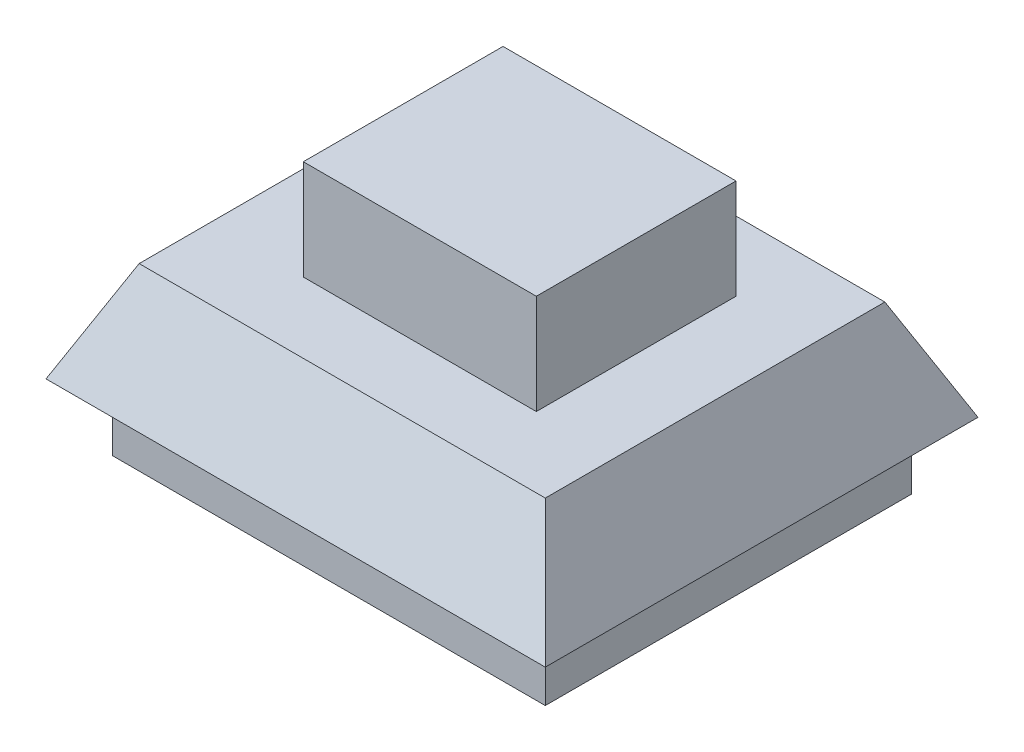
ISO-10303-21;
HEADER;
FILE_DESCRIPTION(('STEP AP214'),'2;1');
FILE_NAME('part.step','',(''),(''),'','','');
FILE_SCHEMA(('AUTOMOTIVE_DESIGN { 1 0 10303 214 1 1 1 1 }'));
ENDSEC;
DATA;
#1=APPLICATION_CONTEXT('core data for automotive mechanical design processes');
#2=APPLICATION_PROTOCOL_DEFINITION('international standard','automotive_design',2000,#1);
#3=PRODUCT_CONTEXT('',#1,'mechanical');
#4=PRODUCT('Part','Part','',(#3));
#5=PRODUCT_RELATED_PRODUCT_CATEGORY('part','',(#4));
#6=PRODUCT_DEFINITION_FORMATION('','',#4);
#7=PRODUCT_DEFINITION_CONTEXT('part definition',#1,'design');
#8=PRODUCT_DEFINITION('design','',#6,#7);
#9=PRODUCT_DEFINITION_SHAPE('','',#8);
#10=(LENGTH_UNIT() NAMED_UNIT(*) SI_UNIT(.MILLI.,.METRE.));
#11=(NAMED_UNIT(*) PLANE_ANGLE_UNIT() SI_UNIT($,.RADIAN.));
#12=(NAMED_UNIT(*) SI_UNIT($,.STERADIAN.) SOLID_ANGLE_UNIT());
#13=UNCERTAINTY_MEASURE_WITH_UNIT(LENGTH_MEASURE(1.E-05),#10,'distance_accuracy_value','');
#14=(GEOMETRIC_REPRESENTATION_CONTEXT(3) GLOBAL_UNCERTAINTY_ASSIGNED_CONTEXT((#13)) GLOBAL_UNIT_ASSIGNED_CONTEXT((#10,
#11,#12)) REPRESENTATION_CONTEXT('',''));
#15=CARTESIAN_POINT('',(0.,0.,0.));
#16=DIRECTION('',(0.,0.,1.));
#17=DIRECTION('',(1.,0.,0.));
#18=AXIS2_PLACEMENT_3D('',#15,#16,#17);
#19=CARTESIAN_POINT('',(0.,0.,0.));
#20=DIRECTION('',(0.,1.,0.));
#21=DIRECTION('',(0.,0.,1.));
#22=AXIS2_PLACEMENT_3D('',#19,#20,#21);
#23=PLANE('',#22);
#24=DIRECTION('',(0.,0.,1.));
#25=VECTOR('',#24,1.);
#26=CARTESIAN_POINT('',(-9.4766355140187,0.,-5.58878504672897));
#27=LINE('',#26,#25);
#28=CARTESIAN_POINT('',(-9.4766355140187,0.,-5.58878504672897));
#29=VERTEX_POINT('',#28);
#30=CARTESIAN_POINT('',(-9.47663551401869,0.,7.41121495327103));
#31=VERTEX_POINT('',#30);
#32=EDGE_CURVE('E184',#29,#31,#27,.T.);
#33=ORIENTED_EDGE('',*,*,#32,.F.);
#34=DIRECTION('',(-1.,0.,0.));
#35=VECTOR('',#34,1.);
#36=CARTESIAN_POINT('',(-9.4766355140187,0.,-5.58878504672897));
#37=LINE('',#36,#35);
#38=CARTESIAN_POINT('',(5.5233644859813,0.,-5.58878504672897));
#39=VERTEX_POINT('',#38);
#40=EDGE_CURVE('E191',#39,#29,#37,.T.);
#41=ORIENTED_EDGE('',*,*,#40,.F.);
#42=DIRECTION('',(0.,0.,-1.));
#43=VECTOR('',#42,1.);
#44=CARTESIAN_POINT('',(5.5233644859813,0.,-5.58878504672897));
#45=LINE('',#44,#43);
#46=CARTESIAN_POINT('',(5.5233644859813,0.,7.41121495327103));
#47=VERTEX_POINT('',#46);
#48=EDGE_CURVE('E189',#47,#39,#45,.T.);
#49=ORIENTED_EDGE('',*,*,#48,.F.);
#50=DIRECTION('',(1.,0.,0.));
#51=VECTOR('',#50,1.);
#52=CARTESIAN_POINT('',(-9.47663551401869,0.,7.41121495327103));
#53=LINE('',#52,#51);
#54=EDGE_CURVE('E187',#31,#47,#53,.T.);
#55=ORIENTED_EDGE('',*,*,#54,.F.);
#56=EDGE_LOOP('',(#33,#41,#49,#55));
#57=FACE_BOUND('',#56,.T.);
#58=DIRECTION('',(0.,0.,1.));
#59=VECTOR('',#58,1.);
#60=CARTESIAN_POINT('',(4.5233644859813,0.,6.41121495327103));
#61=LINE('',#60,#59);
#62=CARTESIAN_POINT('',(4.5233644859813,0.,-4.58878504672897));
#63=VERTEX_POINT('',#62);
#64=CARTESIAN_POINT('',(4.5233644859813,0.,6.41121495327103));
#65=VERTEX_POINT('',#64);
#66=EDGE_CURVE('E52',#63,#65,#61,.T.);
#67=ORIENTED_EDGE('',*,*,#66,.F.);
#68=DIRECTION('',(1.,0.,0.));
#69=VECTOR('',#68,1.);
#70=CARTESIAN_POINT('',(-8.47663551401869,0.,-4.58878504672897));
#71=LINE('',#70,#69);
#72=CARTESIAN_POINT('',(-8.47663551401869,0.,-4.58878504672897));
#73=VERTEX_POINT('',#72);
#74=EDGE_CURVE('E56',#73,#63,#71,.T.);
#75=ORIENTED_EDGE('',*,*,#74,.F.);
#76=DIRECTION('',(0.,0.,-1.));
#77=VECTOR('',#76,1.);
#78=CARTESIAN_POINT('',(-8.4766355140187,0.,6.41121495327103));
#79=LINE('',#78,#77);
#80=CARTESIAN_POINT('',(-8.4766355140187,0.,6.41121495327103));
#81=VERTEX_POINT('',#80);
#82=EDGE_CURVE('E370',#81,#73,#79,.T.);
#83=ORIENTED_EDGE('',*,*,#82,.F.);
#84=DIRECTION('',(-1.,0.,0.));
#85=VECTOR('',#84,1.);
#86=CARTESIAN_POINT('',(-8.4766355140187,0.,6.41121495327103));
#87=LINE('',#86,#85);
#88=EDGE_CURVE('E376',#65,#81,#87,.T.);
#89=ORIENTED_EDGE('',*,*,#88,.F.);
#90=EDGE_LOOP('',(#67,#75,#83,#89));
#91=FACE_BOUND('',#90,.T.);
#92=ADVANCED_FACE('F35',(#57,#91),#23,.F.);
#93=CARTESIAN_POINT('',(-9.4766355140187,0.,-5.58878504672897));
#94=DIRECTION('',(-0.906307787036649,0.4226182617407,0.));
#95=DIRECTION('',(-0.4226182617407,-0.90630778703665,0.));
#96=AXIS2_PLACEMENT_3D('',#93,#94,#95);
#97=PLANE('',#96);
#98=ORIENTED_EDGE('',*,*,#32,.T.);
#99=DIRECTION('',(-0.389281620635026,-0.834817129478987,0.389281620635026));
#100=VECTOR('',#99,1.);
#101=CARTESIAN_POINT('',(-9.47663551401869,0.,7.41121495327103));
#102=LINE('',#101,#100);
#103=CARTESIAN_POINT('',(-8.0777125395537,3.,6.01229197880603));
#104=VERTEX_POINT('',#103);
#105=EDGE_CURVE('E11',#104,#31,#102,.T.);
#106=ORIENTED_EDGE('',*,*,#105,.F.);
#107=DIRECTION('',(0.,0.,-1.));
#108=VECTOR('',#107,1.);
#109=CARTESIAN_POINT('',(-8.0777125395537,3.,-5.58878504672897));
#110=LINE('',#109,#108);
#111=CARTESIAN_POINT('',(-8.0777125395537,3.,-4.18986207226397));
#112=VERTEX_POINT('',#111);
#113=EDGE_CURVE('E192',#112,#104,#110,.F.);
#114=ORIENTED_EDGE('',*,*,#113,.F.);
#115=DIRECTION('',(-0.389281620635026,-0.834817129478987,-0.389281620635026));
#116=VECTOR('',#115,1.);
#117=CARTESIAN_POINT('',(-9.4766355140187,0.,-5.58878504672897));
#118=LINE('',#117,#116);
#119=EDGE_CURVE('E194',#112,#29,#118,.T.);
#120=ORIENTED_EDGE('',*,*,#119,.T.);
#121=EDGE_LOOP('',(#98,#106,#114,#120));
#122=FACE_BOUND('',#121,.T.);
#123=ADVANCED_FACE('F219',(#122),#97,.T.);
#124=CARTESIAN_POINT('',(-9.47663551401869,0.,7.41121495327103));
#125=DIRECTION('',(0.,0.4226182617407,0.90630778703665));
#126=DIRECTION('',(0.,-0.90630778703665,0.4226182617407));
#127=AXIS2_PLACEMENT_3D('',#124,#125,#126);
#128=PLANE('',#127);
#129=ORIENTED_EDGE('',*,*,#54,.T.);
#130=DIRECTION('',(0.389281620635026,-0.834817129478987,0.389281620635026));
#131=VECTOR('',#130,1.);
#132=CARTESIAN_POINT('',(3.55334214384629,4.22472654626698,5.44119261113601));
#133=LINE('',#132,#131);
#134=CARTESIAN_POINT('',(4.12444151151631,3.,6.01229197880603));
#135=VERTEX_POINT('',#134);
#136=EDGE_CURVE('E44',#135,#47,#133,.T.);
#137=ORIENTED_EDGE('',*,*,#136,.F.);
#138=DIRECTION('',(-1.,0.,0.));
#139=VECTOR('',#138,1.);
#140=CARTESIAN_POINT('',(-9.47663551401869,3.,6.01229197880603));
#141=LINE('',#140,#139);
#142=EDGE_CURVE('E204',#104,#135,#141,.F.);
#143=ORIENTED_EDGE('',*,*,#142,.F.);
#144=ORIENTED_EDGE('',*,*,#105,.T.);
#145=EDGE_LOOP('',(#129,#137,#143,#144));
#146=FACE_BOUND('',#145,.T.);
#147=ADVANCED_FACE('F37',(#146),#128,.T.);
#148=CARTESIAN_POINT('',(5.5233644859813,0.,-5.58878504672897));
#149=DIRECTION('',(0.906307787036649,0.4226182617407,0.));
#150=DIRECTION('',(-0.4226182617407,0.90630778703665,0.));
#151=AXIS2_PLACEMENT_3D('',#148,#149,#150);
#152=PLANE('',#151);
#153=ORIENTED_EDGE('',*,*,#48,.T.);
#154=DIRECTION('',(0.389281620635026,-0.834817129478987,-0.389281620635026));
#155=VECTOR('',#154,1.);
#156=CARTESIAN_POINT('',(3.25026178351782,4.8746844764619,-3.31568234426549));
#157=LINE('',#156,#155);
#158=CARTESIAN_POINT('',(4.1244415115163,3.,-4.18986207226397));
#159=VERTEX_POINT('',#158);
#160=EDGE_CURVE('E197',#159,#39,#157,.T.);
#161=ORIENTED_EDGE('',*,*,#160,.F.);
#162=DIRECTION('',(0.,0.,1.));
#163=VECTOR('',#162,1.);
#164=CARTESIAN_POINT('',(4.1244415115163,3.,-5.58878504672897));
#165=LINE('',#164,#163);
#166=EDGE_CURVE('E205',#135,#159,#165,.F.);
#167=ORIENTED_EDGE('',*,*,#166,.F.);
#168=ORIENTED_EDGE('',*,*,#136,.T.);
#169=EDGE_LOOP('',(#153,#161,#167,#168));
#170=FACE_BOUND('',#169,.T.);
#171=ADVANCED_FACE('F224',(#170),#152,.T.);
#172=CARTESIAN_POINT('',(-9.4766355140187,0.,-5.58878504672897));
#173=DIRECTION('',(0.,0.4226182617407,-0.90630778703665));
#174=DIRECTION('',(0.,0.90630778703665,0.4226182617407));
#175=AXIS2_PLACEMENT_3D('',#172,#173,#174);
#176=PLANE('',#175);
#177=ORIENTED_EDGE('',*,*,#40,.T.);
#178=ORIENTED_EDGE('',*,*,#119,.F.);
#179=DIRECTION('',(1.,0.,0.));
#180=VECTOR('',#179,1.);
#181=CARTESIAN_POINT('',(-9.4766355140187,3.,-4.18986207226397));
#182=LINE('',#181,#180);
#183=EDGE_CURVE('E39',#159,#112,#182,.F.);
#184=ORIENTED_EDGE('',*,*,#183,.F.);
#185=ORIENTED_EDGE('',*,*,#160,.T.);
#186=EDGE_LOOP('',(#177,#178,#184,#185));
#187=FACE_BOUND('',#186,.T.);
#188=ADVANCED_FACE('F215',(#187),#176,.T.);
#189=CARTESIAN_POINT('',(0.,3.,0.));
#190=DIRECTION('',(0.,1.,0.));
#191=DIRECTION('',(0.,0.,1.));
#192=AXIS2_PLACEMENT_3D('',#189,#190,#191);
#193=PLANE('',#192);
#194=DIRECTION('',(0.,0.,-1.));
#195=VECTOR('',#194,1.);
#196=CARTESIAN_POINT('',(1.73869797657819,3.,-2.10416601034304));
#197=LINE('',#196,#195);
#198=CARTESIAN_POINT('',(1.7386979765782,3.,3.89583398965696));
#199=VERTEX_POINT('',#198);
#200=CARTESIAN_POINT('',(1.73869797657819,3.,-2.10416601034304));
#201=VERTEX_POINT('',#200);
#202=EDGE_CURVE('E146',#199,#201,#197,.T.);
#203=ORIENTED_EDGE('',*,*,#202,.F.);
#204=DIRECTION('',(1.,0.,0.));
#205=VECTOR('',#204,1.);
#206=CARTESIAN_POINT('',(-5.2613020234218,3.,3.89583398965696));
#207=LINE('',#206,#205);
#208=CARTESIAN_POINT('',(-5.2613020234218,3.,3.89583398965696));
#209=VERTEX_POINT('',#208);
#210=EDGE_CURVE('E159',#209,#199,#207,.T.);
#211=ORIENTED_EDGE('',*,*,#210,.F.);
#212=DIRECTION('',(0.,0.,1.));
#213=VECTOR('',#212,1.);
#214=CARTESIAN_POINT('',(-5.26130202342181,3.,-2.10416601034304));
#215=LINE('',#214,#213);
#216=CARTESIAN_POINT('',(-5.26130202342181,3.,-2.10416601034304));
#217=VERTEX_POINT('',#216);
#218=EDGE_CURVE('E168',#217,#209,#215,.T.);
#219=ORIENTED_EDGE('',*,*,#218,.F.);
#220=DIRECTION('',(-1.,0.,0.));
#221=VECTOR('',#220,1.);
#222=CARTESIAN_POINT('',(-5.26130202342181,3.,-2.10416601034304));
#223=LINE('',#222,#221);
#224=EDGE_CURVE('E149',#201,#217,#223,.T.);
#225=ORIENTED_EDGE('',*,*,#224,.F.);
#226=EDGE_LOOP('',(#203,#211,#219,#225));
#227=FACE_BOUND('',#226,.T.);
#228=ORIENTED_EDGE('',*,*,#113,.T.);
#229=ORIENTED_EDGE('',*,*,#142,.T.);
#230=ORIENTED_EDGE('',*,*,#166,.T.);
#231=ORIENTED_EDGE('',*,*,#183,.T.);
#232=EDGE_LOOP('',(#228,#229,#230,#231));
#233=FACE_BOUND('',#232,.T.);
#234=ADVANCED_FACE('F211',(#227,#233),#193,.T.);
#235=CARTESIAN_POINT('',(1.73869797657819,6.,-2.10416601034304));
#236=DIRECTION('',(-1.,0.,0.));
#237=DIRECTION('',(0.,0.,1.));
#238=AXIS2_PLACEMENT_3D('',#235,#236,#237);
#239=PLANE('',#238);
#240=ORIENTED_EDGE('',*,*,#202,.T.);
#241=DIRECTION('',(0.,-1.,0.));
#242=VECTOR('',#241,1.);
#243=CARTESIAN_POINT('',(1.73869797657819,6.,-2.10416601034304));
#244=LINE('',#243,#242);
#245=CARTESIAN_POINT('',(1.73869797657819,6.,-2.10416601034304));
#246=VERTEX_POINT('',#245);
#247=EDGE_CURVE('E181',#246,#201,#244,.T.);
#248=ORIENTED_EDGE('',*,*,#247,.F.);
#249=DIRECTION('',(0.,0.,-1.));
#250=VECTOR('',#249,1.);
#251=CARTESIAN_POINT('',(1.73869797657819,6.,-2.10416601034304));
#252=LINE('',#251,#250);
#253=CARTESIAN_POINT('',(1.7386979765782,6.,3.89583398965696));
#254=VERTEX_POINT('',#253);
#255=EDGE_CURVE('E155',#254,#246,#252,.T.);
#256=ORIENTED_EDGE('',*,*,#255,.F.);
#257=DIRECTION('',(0.,-1.,0.));
#258=VECTOR('',#257,1.);
#259=CARTESIAN_POINT('',(1.7386979765782,6.,3.89583398965696));
#260=LINE('',#259,#258);
#261=EDGE_CURVE('E164',#254,#199,#260,.T.);
#262=ORIENTED_EDGE('',*,*,#261,.T.);
#263=EDGE_LOOP('',(#240,#248,#256,#262));
#264=FACE_BOUND('',#263,.T.);
#265=ADVANCED_FACE('F267',(#264),#239,.F.);
#266=CARTESIAN_POINT('',(-5.26130202342181,6.,-2.10416601034304));
#267=DIRECTION('',(0.,0.,1.));
#268=DIRECTION('',(1.,0.,0.));
#269=AXIS2_PLACEMENT_3D('',#266,#267,#268);
#270=PLANE('',#269);
#271=ORIENTED_EDGE('',*,*,#224,.T.);
#272=DIRECTION('',(0.,-1.,0.));
#273=VECTOR('',#272,1.);
#274=CARTESIAN_POINT('',(-5.26130202342181,6.,-2.10416601034304));
#275=LINE('',#274,#273);
#276=CARTESIAN_POINT('',(-5.26130202342181,6.,-2.10416601034304));
#277=VERTEX_POINT('',#276);
#278=EDGE_CURVE('E178',#277,#217,#275,.T.);
#279=ORIENTED_EDGE('',*,*,#278,.F.);
#280=DIRECTION('',(-1.,0.,0.));
#281=VECTOR('',#280,1.);
#282=CARTESIAN_POINT('',(-5.26130202342181,6.,-2.10416601034304));
#283=LINE('',#282,#281);
#284=EDGE_CURVE('E158',#246,#277,#283,.T.);
#285=ORIENTED_EDGE('',*,*,#284,.F.);
#286=ORIENTED_EDGE('',*,*,#247,.T.);
#287=EDGE_LOOP('',(#271,#279,#285,#286));
#288=FACE_BOUND('',#287,.T.);
#289=ADVANCED_FACE('F275',(#288),#270,.F.);
#290=CARTESIAN_POINT('',(-5.26130202342181,6.,-2.10416601034304));
#291=DIRECTION('',(1.,0.,0.));
#292=DIRECTION('',(0.,0.,-1.));
#293=AXIS2_PLACEMENT_3D('',#290,#291,#292);
#294=PLANE('',#293);
#295=ORIENTED_EDGE('',*,*,#218,.T.);
#296=DIRECTION('',(0.,-1.,0.));
#297=VECTOR('',#296,1.);
#298=CARTESIAN_POINT('',(-5.2613020234218,6.,3.89583398965696));
#299=LINE('',#298,#297);
#300=CARTESIAN_POINT('',(-5.2613020234218,6.,3.89583398965696));
#301=VERTEX_POINT('',#300);
#302=EDGE_CURVE('E175',#301,#209,#299,.T.);
#303=ORIENTED_EDGE('',*,*,#302,.F.);
#304=DIRECTION('',(0.,0.,1.));
#305=VECTOR('',#304,1.);
#306=CARTESIAN_POINT('',(-5.26130202342181,6.,-2.10416601034304));
#307=LINE('',#306,#305);
#308=EDGE_CURVE('E161',#277,#301,#307,.T.);
#309=ORIENTED_EDGE('',*,*,#308,.F.);
#310=ORIENTED_EDGE('',*,*,#278,.T.);
#311=EDGE_LOOP('',(#295,#303,#309,#310));
#312=FACE_BOUND('',#311,.T.);
#313=ADVANCED_FACE('F283',(#312),#294,.F.);
#314=CARTESIAN_POINT('',(-5.2613020234218,6.,3.89583398965696));
#315=DIRECTION('',(0.,0.,-1.));
#316=DIRECTION('',(-1.,0.,0.));
#317=AXIS2_PLACEMENT_3D('',#314,#315,#316);
#318=PLANE('',#317);
#319=ORIENTED_EDGE('',*,*,#210,.T.);
#320=ORIENTED_EDGE('',*,*,#261,.F.);
#321=DIRECTION('',(1.,0.,0.));
#322=VECTOR('',#321,1.);
#323=CARTESIAN_POINT('',(-5.2613020234218,6.,3.89583398965696));
#324=LINE('',#323,#322);
#325=EDGE_CURVE('E163',#301,#254,#324,.T.);
#326=ORIENTED_EDGE('',*,*,#325,.F.);
#327=ORIENTED_EDGE('',*,*,#302,.T.);
#328=EDGE_LOOP('',(#319,#320,#326,#327));
#329=FACE_BOUND('',#328,.T.);
#330=ADVANCED_FACE('F292',(#329),#318,.F.);
#331=CARTESIAN_POINT('',(0.,6.,0.));
#332=DIRECTION('',(0.,1.,0.));
#333=DIRECTION('',(0.,0.,1.));
#334=AXIS2_PLACEMENT_3D('',#331,#332,#333);
#335=PLANE('',#334);
#336=ORIENTED_EDGE('',*,*,#255,.T.);
#337=ORIENTED_EDGE('',*,*,#284,.T.);
#338=ORIENTED_EDGE('',*,*,#308,.T.);
#339=ORIENTED_EDGE('',*,*,#325,.T.);
#340=EDGE_LOOP('',(#336,#337,#338,#339));
#341=FACE_BOUND('',#340,.T.);
#342=ADVANCED_FACE('F301',(#341),#335,.T.);
#343=CARTESIAN_POINT('',(4.5233644859813,-2.,6.41121495327103));
#344=DIRECTION('',(-1.,0.,0.));
#345=DIRECTION('',(0.,0.,1.));
#346=AXIS2_PLACEMENT_3D('',#343,#344,#345);
#347=PLANE('',#346);
#348=ORIENTED_EDGE('',*,*,#66,.T.);
#349=DIRECTION('',(0.,1.,0.));
#350=VECTOR('',#349,1.);
#351=CARTESIAN_POINT('',(4.5233644859813,-2.,6.41121495327103));
#352=LINE('',#351,#350);
#353=CARTESIAN_POINT('',(4.5233644859813,-2.,6.41121495327103));
#354=VERTEX_POINT('',#353);
#355=EDGE_CURVE('E129',#354,#65,#352,.T.);
#356=ORIENTED_EDGE('',*,*,#355,.F.);
#357=DIRECTION('',(0.,0.,1.));
#358=VECTOR('',#357,1.);
#359=CARTESIAN_POINT('',(4.5233644859813,-2.,6.41121495327103));
#360=LINE('',#359,#358);
#361=CARTESIAN_POINT('',(4.5233644859813,-2.,-4.58878504672897));
#362=VERTEX_POINT('',#361);
#363=EDGE_CURVE('E135',#362,#354,#360,.T.);
#364=ORIENTED_EDGE('',*,*,#363,.F.);
#365=DIRECTION('',(0.,1.,0.));
#366=VECTOR('',#365,1.);
#367=CARTESIAN_POINT('',(4.5233644859813,-2.,-4.58878504672897));
#368=LINE('',#367,#366);
#369=EDGE_CURVE('E368',#362,#63,#368,.T.);
#370=ORIENTED_EDGE('',*,*,#369,.T.);
#371=EDGE_LOOP('',(#348,#356,#364,#370));
#372=FACE_BOUND('',#371,.T.);
#373=ADVANCED_FACE('F145',(#372),#347,.F.);
#374=CARTESIAN_POINT('',(-8.4766355140187,-2.,6.41121495327103));
#375=DIRECTION('',(0.,0.,-1.));
#376=DIRECTION('',(-1.,0.,0.));
#377=AXIS2_PLACEMENT_3D('',#374,#375,#376);
#378=PLANE('',#377);
#379=ORIENTED_EDGE('',*,*,#88,.T.);
#380=DIRECTION('',(0.,1.,0.));
#381=VECTOR('',#380,1.);
#382=CARTESIAN_POINT('',(-8.4766355140187,-2.,6.41121495327103));
#383=LINE('',#382,#381);
#384=CARTESIAN_POINT('',(-8.4766355140187,-2.,6.41121495327103));
#385=VERTEX_POINT('',#384);
#386=EDGE_CURVE('E131',#385,#81,#383,.T.);
#387=ORIENTED_EDGE('',*,*,#386,.F.);
#388=DIRECTION('',(-1.,0.,0.));
#389=VECTOR('',#388,1.);
#390=CARTESIAN_POINT('',(-8.4766355140187,-2.,6.41121495327103));
#391=LINE('',#390,#389);
#392=EDGE_CURVE('E124',#354,#385,#391,.T.);
#393=ORIENTED_EDGE('',*,*,#392,.F.);
#394=ORIENTED_EDGE('',*,*,#355,.T.);
#395=EDGE_LOOP('',(#379,#387,#393,#394));
#396=FACE_BOUND('',#395,.T.);
#397=ADVANCED_FACE('F127',(#396),#378,.F.);
#398=CARTESIAN_POINT('',(-8.4766355140187,-2.,6.41121495327103));
#399=DIRECTION('',(1.,0.,0.));
#400=DIRECTION('',(0.,0.,-1.));
#401=AXIS2_PLACEMENT_3D('',#398,#399,#400);
#402=PLANE('',#401);
#403=ORIENTED_EDGE('',*,*,#82,.T.);
#404=DIRECTION('',(0.,1.,0.));
#405=VECTOR('',#404,1.);
#406=CARTESIAN_POINT('',(-8.47663551401869,-2.,-4.58878504672897));
#407=LINE('',#406,#405);
#408=CARTESIAN_POINT('',(-8.47663551401869,-2.,-4.58878504672897));
#409=VERTEX_POINT('',#408);
#410=EDGE_CURVE('E151',#409,#73,#407,.T.);
#411=ORIENTED_EDGE('',*,*,#410,.F.);
#412=DIRECTION('',(0.,0.,-1.));
#413=VECTOR('',#412,1.);
#414=CARTESIAN_POINT('',(-8.4766355140187,-2.,6.41121495327103));
#415=LINE('',#414,#413);
#416=EDGE_CURVE('E134',#385,#409,#415,.T.);
#417=ORIENTED_EDGE('',*,*,#416,.F.);
#418=ORIENTED_EDGE('',*,*,#386,.T.);
#419=EDGE_LOOP('',(#403,#411,#417,#418));
#420=FACE_BOUND('',#419,.T.);
#421=ADVANCED_FACE('F329',(#420),#402,.F.);
#422=CARTESIAN_POINT('',(-8.47663551401869,-2.,-4.58878504672897));
#423=DIRECTION('',(0.,0.,1.));
#424=DIRECTION('',(1.,0.,0.));
#425=AXIS2_PLACEMENT_3D('',#422,#423,#424);
#426=PLANE('',#425);
#427=ORIENTED_EDGE('',*,*,#74,.T.);
#428=ORIENTED_EDGE('',*,*,#369,.F.);
#429=DIRECTION('',(1.,0.,0.));
#430=VECTOR('',#429,1.);
#431=CARTESIAN_POINT('',(-8.47663551401869,-2.,-4.58878504672897));
#432=LINE('',#431,#430);
#433=EDGE_CURVE('E140',#409,#362,#432,.T.);
#434=ORIENTED_EDGE('',*,*,#433,.F.);
#435=ORIENTED_EDGE('',*,*,#410,.T.);
#436=EDGE_LOOP('',(#427,#428,#434,#435));
#437=FACE_BOUND('',#436,.T.);
#438=ADVANCED_FACE('F337',(#437),#426,.F.);
#439=CARTESIAN_POINT('',(0.,-2.,0.));
#440=DIRECTION('',(0.,-1.,0.));
#441=DIRECTION('',(0.,0.,-1.));
#442=AXIS2_PLACEMENT_3D('',#439,#440,#441);
#443=PLANE('',#442);
#444=ORIENTED_EDGE('',*,*,#363,.T.);
#445=ORIENTED_EDGE('',*,*,#392,.T.);
#446=ORIENTED_EDGE('',*,*,#416,.T.);
#447=ORIENTED_EDGE('',*,*,#433,.T.);
#448=EDGE_LOOP('',(#444,#445,#446,#447));
#449=FACE_BOUND('',#448,.T.);
#450=ADVANCED_FACE('F138',(#449),#443,.T.);
#451=CLOSED_SHELL('',(#92,#123,#147,#171,#188,#234,#265,#289,#313,#330,#342,#373,#397,#421,#438,#450));
#452=MANIFOLD_SOLID_BREP('B2',#451);
#453=ADVANCED_BREP_SHAPE_REPRESENTATION('',(#18,#452),#14);
#454=SHAPE_DEFINITION_REPRESENTATION(#9,#453);
ENDSEC;
END-ISO-10303-21;
